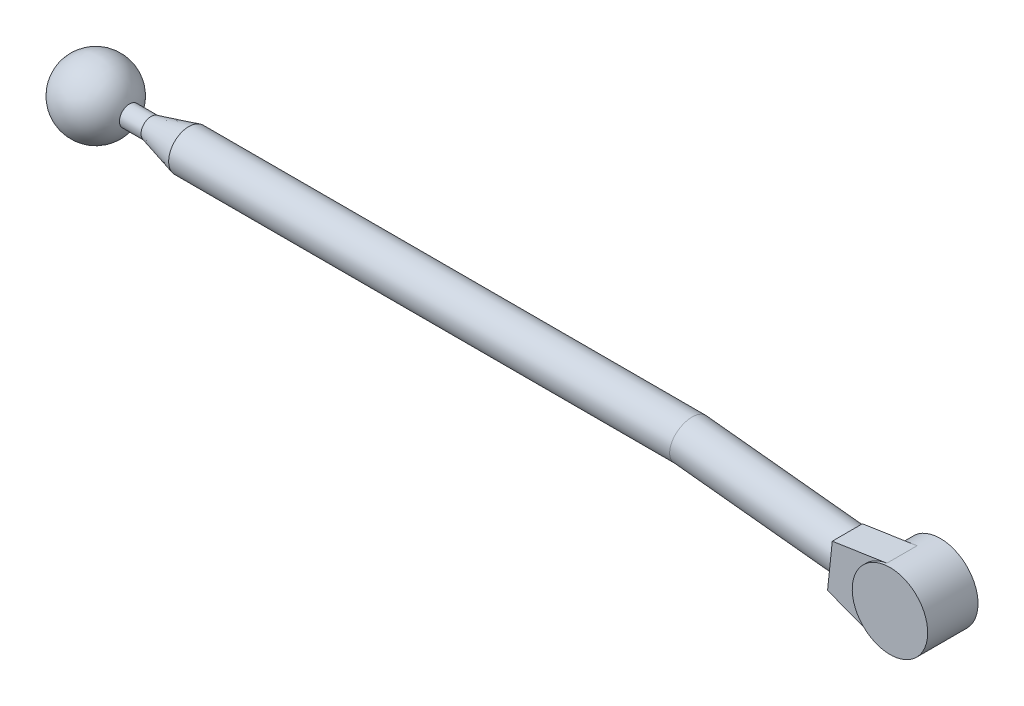
ISO-10303-21;
HEADER;
FILE_DESCRIPTION(('STEP AP214'),'2;1');
FILE_NAME('part.step','',(''),(''),'','','');
FILE_SCHEMA(('AUTOMOTIVE_DESIGN { 1 0 10303 214 1 1 1 1 }'));
ENDSEC;
DATA;
#1=APPLICATION_CONTEXT('core data for automotive mechanical design processes');
#2=APPLICATION_PROTOCOL_DEFINITION('international standard','automotive_design',2000,#1);
#3=PRODUCT_CONTEXT('',#1,'mechanical');
#4=PRODUCT('Part','Part','',(#3));
#5=PRODUCT_RELATED_PRODUCT_CATEGORY('part','',(#4));
#6=PRODUCT_DEFINITION_FORMATION('','',#4);
#7=PRODUCT_DEFINITION_CONTEXT('part definition',#1,'design');
#8=PRODUCT_DEFINITION('design','',#6,#7);
#9=PRODUCT_DEFINITION_SHAPE('','',#8);
#10=(LENGTH_UNIT() NAMED_UNIT(*) SI_UNIT(.MILLI.,.METRE.));
#11=(NAMED_UNIT(*) PLANE_ANGLE_UNIT() SI_UNIT($,.RADIAN.));
#12=(NAMED_UNIT(*) SI_UNIT($,.STERADIAN.) SOLID_ANGLE_UNIT());
#13=UNCERTAINTY_MEASURE_WITH_UNIT(LENGTH_MEASURE(1.E-05),#10,'distance_accuracy_value','');
#14=(GEOMETRIC_REPRESENTATION_CONTEXT(3) GLOBAL_UNCERTAINTY_ASSIGNED_CONTEXT((#13)) GLOBAL_UNIT_ASSIGNED_CONTEXT((#10,
#11,#12)) REPRESENTATION_CONTEXT('',''));
#15=CARTESIAN_POINT('',(0.,0.,0.));
#16=DIRECTION('',(0.,0.,1.));
#17=DIRECTION('',(1.,0.,0.));
#18=AXIS2_PLACEMENT_3D('',#15,#16,#17);
#19=CARTESIAN_POINT('',(237.639440017683,88.4268991587526,1407.2355645497));
#20=DIRECTION('',(0.,1.,0.));
#21=DIRECTION('',(0.,0.,-1.));
#22=AXIS2_PLACEMENT_3D('',#19,#20,#21);
#23=SPHERICAL_SURFACE('',#22,14.);
#24=CARTESIAN_POINT('',(237.639440017683,88.4268991587526,1407.2355645497));
#25=DIRECTION('',(-1.,0.,0.));
#26=DIRECTION('',(0.,1.,0.));
#27=AXIS2_PLACEMENT_3D('',#24,#25,#26);
#28=SPHERICAL_SURFACE('',#27,14.);
#29=CARTESIAN_POINT('',(251.055847882682,88.4268991587526,1407.2355645497));
#30=DIRECTION('',(-0.999999999999999,0.,0.));
#31=DIRECTION('',(0.,1.,0.));
#32=AXIS2_PLACEMENT_3D('',#29,#30,#31);
#33=CIRCLE('',#32,4.);
#34=CARTESIAN_POINT('',(251.055847882682,92.4268991587526,1407.2355645497));
#35=VERTEX_POINT('',#34);
#36=EDGE_CURVE('E179',#35,#35,#33,.F.);
#37=ORIENTED_EDGE('',*,*,#36,.F.);
#38=EDGE_LOOP('',(#37));
#39=FACE_BOUND('',#38,.T.);
#40=ADVANCED_FACE('F49',(#39),#28,.T.);
#41=CARTESIAN_POINT('',(259.639440017683,88.4268991587526,1407.2355645497));
#42=DIRECTION('',(-1.,0.,0.));
#43=DIRECTION('',(0.,1.,0.));
#44=AXIS2_PLACEMENT_3D('',#41,#42,#43);
#45=CYLINDRICAL_SURFACE('',#44,4.);
#46=CARTESIAN_POINT('',(259.639440017683,88.4268991587526,1407.2355645497));
#47=DIRECTION('',(1.,0.,0.));
#48=DIRECTION('',(0.,-1.,0.));
#49=AXIS2_PLACEMENT_3D('',#46,#47,#48);
#50=CIRCLE('',#49,4.);
#51=CARTESIAN_POINT('',(259.639440017683,84.4268991587526,1407.2355645497));
#52=VERTEX_POINT('',#51);
#53=EDGE_CURVE('E182',#52,#52,#50,.T.);
#54=ORIENTED_EDGE('',*,*,#53,.F.);
#55=EDGE_LOOP('',(#54));
#56=FACE_BOUND('',#55,.T.);
#57=ORIENTED_EDGE('',*,*,#36,.T.);
#58=EDGE_LOOP('',(#57));
#59=FACE_BOUND('',#58,.T.);
#60=ADVANCED_FACE('F168',(#56,#59),#45,.T.);
#61=CARTESIAN_POINT('',(259.639440017683,88.4268991587526,1407.2355645497));
#62=DIRECTION('',(1.,0.,0.));
#63=DIRECTION('',(0.,-1.,0.));
#64=AXIS2_PLACEMENT_3D('',#61,#62,#63);
#65=CONICAL_SURFACE('',#64,4.,0.261799387799149);
#66=CARTESIAN_POINT('',(274.639440017683,88.4268991587526,1407.2355645497));
#67=DIRECTION('',(1.,0.,0.));
#68=DIRECTION('',(0.,-1.,0.));
#69=AXIS2_PLACEMENT_3D('',#66,#67,#68);
#70=CIRCLE('',#69,8.01923788646685);
#71=CARTESIAN_POINT('',(274.639440017683,80.4076612722857,1407.2355645497));
#72=VERTEX_POINT('',#71);
#73=EDGE_CURVE('E150',#72,#72,#70,.T.);
#74=ORIENTED_EDGE('',*,*,#73,.F.);
#75=EDGE_LOOP('',(#74));
#76=FACE_BOUND('',#75,.T.);
#77=ORIENTED_EDGE('',*,*,#53,.T.);
#78=EDGE_LOOP('',(#77));
#79=FACE_BOUND('',#78,.T.);
#80=ADVANCED_FACE('F164',(#76,#79),#65,.T.);
#81=CARTESIAN_POINT('',(474.639440017683,88.4268991587526,1407.2355645497));
#82=DIRECTION('',(-1.,0.,0.));
#83=DIRECTION('',(0.,1.,0.));
#84=AXIS2_PLACEMENT_3D('',#81,#82,#83);
#85=CYLINDRICAL_SURFACE('',#84,8.01923788646685);
#86=CARTESIAN_POINT('',(473.796584152213,88.4268991587526,1407.2355645497));
#87=DIRECTION('',(0.994521895368274,-0.104528463267644,0.));
#88=DIRECTION('',(-0.104528463267644,-0.994521895368274,0.));
#89=AXIS2_PLACEMENT_3D('',#86,#87,#88);
#90=ELLIPSE('',#89,8.06341009063184,8.01923788646685);
#91=CARTESIAN_POINT('',(472.953728286742,80.4076612722857,1407.2355645497));
#92=VERTEX_POINT('',#91);
#93=EDGE_CURVE('E146',#92,#92,#90,.T.);
#94=ORIENTED_EDGE('',*,*,#93,.F.);
#95=EDGE_LOOP('',(#94));
#96=FACE_BOUND('',#95,.T.);
#97=ORIENTED_EDGE('',*,*,#73,.T.);
#98=EDGE_LOOP('',(#97));
#99=FACE_BOUND('',#98,.T.);
#100=ADVANCED_FACE('F159',(#96,#99),#85,.T.);
#101=CARTESIAN_POINT('',(538.440507351151,81.6325490463557,1407.2355645497));
#102=DIRECTION('',(0.994521895368274,-0.104528463267644,0.));
#103=DIRECTION('',(-0.104528463267644,-0.994521895368274,0.));
#104=AXIS2_PLACEMENT_3D('',#101,#102,#103);
#105=ELLIPSE('',#104,8.06341009063184,8.01923788646685);
#106=DIRECTION('',(-0.994521895368274,0.104528463267644,0.));
#107=VECTOR('',#106,1.);
#108=SURFACE_OF_LINEAR_EXTRUSION('',#105,#107);
#109=CARTESIAN_POINT('',(537.658852755104,74.1956023422475,1404.2355645497));
#110=VERTEX_POINT('',#109);
#111=CARTESIAN_POINT('',(539.222161947197,89.069495750464,1404.2355645497));
#112=VERTEX_POINT('',#111);
#113=EDGE_CURVE('E68',#110,#112,#105,.T.);
#114=ORIENTED_EDGE('',*,*,#113,.F.);
#115=EDGE_CURVE('E151',#112,#110,#105,.T.);
#116=ORIENTED_EDGE('',*,*,#115,.F.);
#117=EDGE_LOOP('',(#114,#116));
#118=FACE_BOUND('',#117,.T.);
#119=ORIENTED_EDGE('',*,*,#93,.T.);
#120=EDGE_LOOP('',(#119));
#121=FACE_BOUND('',#120,.T.);
#122=ADVANCED_FACE('F154',(#118,#121),#108,.F.);
#123=CARTESIAN_POINT('',(538.440507351151,81.6325490463557,1407.2355645497));
#124=DIRECTION('',(0.994521895368274,-0.104528463267644,0.));
#125=DIRECTION('',(-0.104528463267644,-0.994521895368274,0.));
#126=AXIS2_PLACEMENT_3D('',#123,#124,#125);
#127=PLANE('',#126);
#128=DIRECTION('',(0.104528463267639,0.994521895368275,0.));
#129=VECTOR('',#128,1.);
#130=CARTESIAN_POINT('',(539.38126352056,90.5832461046702,1404.2355645497));
#131=LINE('',#130,#129);
#132=EDGE_CURVE('E65',#110,#112,#131,.T.);
#133=ORIENTED_EDGE('',*,*,#132,.F.);
#134=ORIENTED_EDGE('',*,*,#113,.T.);
#135=EDGE_LOOP('',(#133,#134));
#136=FACE_BOUND('',#135,.T.);
#137=ADVANCED_FACE('F158',(#136),#127,.T.);
#138=CARTESIAN_POINT('',(539.38126352056,90.5832461046702,1404.2355645497));
#139=DIRECTION('',(0.994521895368275,-0.104528463267639,0.));
#140=DIRECTION('',(-0.104528463267639,-0.994521895368275,0.));
#141=AXIS2_PLACEMENT_3D('',#138,#139,#140);
#142=PLANE('',#141);
#143=CARTESIAN_POINT('',(539.38126352056,90.5832461046702,1404.2355645497));
#144=VERTEX_POINT('',#143);
#145=EDGE_CURVE('E131',#112,#144,#131,.T.);
#146=ORIENTED_EDGE('',*,*,#145,.F.);
#147=ORIENTED_EDGE('',*,*,#115,.T.);
#148=CARTESIAN_POINT('',(537.499751181742,72.6818519880413,1404.2355645497));
#149=VERTEX_POINT('',#148);
#150=EDGE_CURVE('E186',#149,#110,#131,.T.);
#151=ORIENTED_EDGE('',*,*,#150,.F.);
#152=DIRECTION('',(0.,0.,1.));
#153=VECTOR('',#152,1.);
#154=CARTESIAN_POINT('',(537.499751181742,72.6818519880413,1404.2355645497));
#155=LINE('',#154,#153);
#156=CARTESIAN_POINT('',(537.499751181742,72.6818519880413,1416.2355645497));
#157=VERTEX_POINT('',#156);
#158=EDGE_CURVE('E143',#149,#157,#155,.T.);
#159=ORIENTED_EDGE('',*,*,#158,.T.);
#160=DIRECTION('',(0.104528463267639,0.994521895368275,0.));
#161=VECTOR('',#160,1.);
#162=CARTESIAN_POINT('',(539.38126352056,90.5832461046702,1416.2355645497));
#163=LINE('',#162,#161);
#164=CARTESIAN_POINT('',(539.38126352056,90.5832461046702,1416.2355645497));
#165=VERTEX_POINT('',#164);
#166=EDGE_CURVE('E103',#157,#165,#163,.T.);
#167=ORIENTED_EDGE('',*,*,#166,.T.);
#168=DIRECTION('',(0.,0.,1.));
#169=VECTOR('',#168,1.);
#170=CARTESIAN_POINT('',(539.38126352056,90.5832461046702,1404.2355645497));
#171=LINE('',#170,#169);
#172=EDGE_CURVE('E139',#144,#165,#171,.T.);
#173=ORIENTED_EDGE('',*,*,#172,.F.);
#174=EDGE_LOOP('',(#146,#147,#151,#159,#167,#173));
#175=FACE_BOUND('',#174,.T.);
#176=ADVANCED_FACE('F228',(#175),#142,.F.);
#177=CARTESIAN_POINT('',(537.499751181742,72.6818519880413,1404.2355645497));
#178=DIRECTION('',(0.351367061986771,0.936237783765847,0.));
#179=DIRECTION('',(0.936237783765847,-0.351367061986771,0.));
#180=AXIS2_PLACEMENT_3D('',#177,#178,#179);
#181=PLANE('',#180);
#182=DIRECTION('',(-0.936237783765847,0.351367061986771,0.));
#183=VECTOR('',#182,1.);
#184=CARTESIAN_POINT('',(537.499751181742,72.6818519880413,1416.2355645497));
#185=LINE('',#184,#183);
#186=CARTESIAN_POINT('',(558.033048805556,64.975770708177,1416.2355645497));
#187=VERTEX_POINT('',#186);
#188=EDGE_CURVE('E96',#187,#157,#185,.T.);
#189=ORIENTED_EDGE('',*,*,#188,.T.);
#190=ORIENTED_EDGE('',*,*,#158,.F.);
#191=DIRECTION('',(-0.936237783765847,0.351367061986771,0.));
#192=VECTOR('',#191,1.);
#193=CARTESIAN_POINT('',(537.499751181742,72.6818519880413,1404.2355645497));
#194=LINE('',#193,#192);
#195=CARTESIAN_POINT('',(558.033048805556,64.975770708177,1404.2355645497));
#196=VERTEX_POINT('',#195);
#197=EDGE_CURVE('E115',#196,#149,#194,.T.);
#198=ORIENTED_EDGE('',*,*,#197,.F.);
#199=DIRECTION('',(0.,0.,1.));
#200=VECTOR('',#199,1.);
#201=CARTESIAN_POINT('',(558.033048805556,64.975770708177,1404.2355645497));
#202=LINE('',#201,#200);
#203=EDGE_CURVE('E112',#196,#187,#202,.T.);
#204=ORIENTED_EDGE('',*,*,#203,.T.);
#205=EDGE_LOOP('',(#189,#190,#198,#204));
#206=FACE_BOUND('',#205,.T.);
#207=ADVANCED_FACE('F113',(#206),#181,.F.);
#208=CARTESIAN_POINT('',(539.38126352056,90.5832461046702,1404.2355645497));
#209=DIRECTION('',(0.149034068029049,-0.988832061862232,0.));
#210=DIRECTION('',(-0.988832061862232,-0.149034068029049,0.));
#211=AXIS2_PLACEMENT_3D('',#208,#209,#210);
#212=PLANE('',#211);
#213=DIRECTION('',(0.988832061862232,0.149034068029049,0.));
#214=VECTOR('',#213,1.);
#215=CARTESIAN_POINT('',(539.38126352056,90.5832461046702,1416.2355645497));
#216=LINE('',#215,#214);
#217=CARTESIAN_POINT('',(561.068043714922,93.8518183925981,1416.2355645497));
#218=VERTEX_POINT('',#217);
#219=EDGE_CURVE('E126',#165,#218,#216,.T.);
#220=ORIENTED_EDGE('',*,*,#219,.T.);
#221=DIRECTION('',(0.,0.,1.));
#222=VECTOR('',#221,1.);
#223=CARTESIAN_POINT('',(561.068043714922,93.8518183925981,1404.2355645497));
#224=LINE('',#223,#222);
#225=CARTESIAN_POINT('',(561.068043714922,93.8518183925981,1404.2355645497));
#226=VERTEX_POINT('',#225);
#227=EDGE_CURVE('E119',#226,#218,#224,.T.);
#228=ORIENTED_EDGE('',*,*,#227,.F.);
#229=DIRECTION('',(0.988832061862232,0.149034068029049,0.));
#230=VECTOR('',#229,1.);
#231=CARTESIAN_POINT('',(539.38126352056,90.5832461046702,1404.2355645497));
#232=LINE('',#231,#230);
#233=EDGE_CURVE('E220',#144,#226,#232,.T.);
#234=ORIENTED_EDGE('',*,*,#233,.F.);
#235=ORIENTED_EDGE('',*,*,#172,.T.);
#236=EDGE_LOOP('',(#220,#228,#234,#235));
#237=FACE_BOUND('',#236,.T.);
#238=ADVANCED_FACE('F231',(#237),#212,.F.);
#239=CARTESIAN_POINT('',(563.303554735358,79.0193374646647,1404.2355645497));
#240=DIRECTION('',(0.,0.,-1.));
#241=DIRECTION('',(0.,1.,0.));
#242=AXIS2_PLACEMENT_3D('',#239,#240,#241);
#243=PLANE('',#242);
#244=ORIENTED_EDGE('',*,*,#197,.T.);
#245=ORIENTED_EDGE('',*,*,#150,.T.);
#246=ORIENTED_EDGE('',*,*,#132,.T.);
#247=ORIENTED_EDGE('',*,*,#145,.T.);
#248=ORIENTED_EDGE('',*,*,#233,.T.);
#249=CARTESIAN_POINT('',(563.303554735358,79.0193374646647,1404.2355645497));
#250=DIRECTION('',(0.,0.,1.));
#251=DIRECTION('',(0.,1.,0.));
#252=AXIS2_PLACEMENT_3D('',#249,#250,#251);
#253=CIRCLE('',#252,15.);
#254=EDGE_CURVE('E120',#226,#196,#253,.T.);
#255=ORIENTED_EDGE('',*,*,#254,.T.);
#256=EDGE_LOOP('',(#244,#245,#246,#247,#248,#255));
#257=FACE_BOUND('',#256,.T.);
#258=ADVANCED_FACE('F233',(#257),#243,.T.);
#259=CARTESIAN_POINT('',(563.303554735358,79.0193374646647,1416.2355645497));
#260=DIRECTION('',(0.,0.,-1.));
#261=DIRECTION('',(0.,1.,0.));
#262=AXIS2_PLACEMENT_3D('',#259,#260,#261);
#263=PLANE('',#262);
#264=ORIENTED_EDGE('',*,*,#188,.F.);
#265=CARTESIAN_POINT('',(563.303554735358,79.0193374646647,1416.2355645497));
#266=DIRECTION('',(0.,0.,1.));
#267=DIRECTION('',(0.,1.,0.));
#268=AXIS2_PLACEMENT_3D('',#265,#266,#267);
#269=CIRCLE('',#268,15.);
#270=EDGE_CURVE('E101',#218,#187,#269,.T.);
#271=ORIENTED_EDGE('',*,*,#270,.F.);
#272=ORIENTED_EDGE('',*,*,#219,.F.);
#273=ORIENTED_EDGE('',*,*,#166,.F.);
#274=EDGE_LOOP('',(#264,#271,#272,#273));
#275=FACE_BOUND('',#274,.T.);
#276=ADVANCED_FACE('F98',(#275),#263,.F.);
#277=CARTESIAN_POINT('',(563.303554735358,79.0193374646647,1397.2355645497));
#278=DIRECTION('',(0.,0.,1.));
#279=DIRECTION('',(0.,-1.,0.));
#280=AXIS2_PLACEMENT_3D('',#277,#278,#279);
#281=CYLINDRICAL_SURFACE('',#280,15.);
#282=ORIENTED_EDGE('',*,*,#254,.F.);
#283=ORIENTED_EDGE('',*,*,#227,.T.);
#284=ORIENTED_EDGE('',*,*,#270,.T.);
#285=ORIENTED_EDGE('',*,*,#203,.F.);
#286=EDGE_LOOP('',(#282,#283,#284,#285));
#287=FACE_BOUND('',#286,.T.);
#288=CARTESIAN_POINT('',(563.303554735358,79.0193374646647,1397.2355645497));
#289=DIRECTION('',(0.,0.,-1.));
#290=DIRECTION('',(0.,1.,0.));
#291=AXIS2_PLACEMENT_3D('',#288,#289,#290);
#292=CIRCLE('',#291,15.);
#293=CARTESIAN_POINT('',(563.303554735358,94.0193374646647,1397.2355645497));
#294=VERTEX_POINT('',#293);
#295=EDGE_CURVE('E108',#294,#294,#292,.T.);
#296=ORIENTED_EDGE('',*,*,#295,.F.);
#297=EDGE_LOOP('',(#296));
#298=FACE_BOUND('',#297,.T.);
#299=CARTESIAN_POINT('',(563.303554735358,79.0193374646647,1417.2355645497));
#300=DIRECTION('',(0.,0.,-1.));
#301=DIRECTION('',(0.,1.,0.));
#302=AXIS2_PLACEMENT_3D('',#299,#300,#301);
#303=CIRCLE('',#302,15.);
#304=CARTESIAN_POINT('',(563.303554735358,94.0193374646647,1417.2355645497));
#305=VERTEX_POINT('',#304);
#306=EDGE_CURVE('E212',#305,#305,#303,.T.);
#307=ORIENTED_EDGE('',*,*,#306,.T.);
#308=EDGE_LOOP('',(#307));
#309=FACE_BOUND('',#308,.T.);
#310=ADVANCED_FACE('F122',(#287,#298,#309),#281,.T.);
#311=CARTESIAN_POINT('',(563.303554735358,79.0193374646647,1397.2355645497));
#312=DIRECTION('',(0.,0.,-1.));
#313=DIRECTION('',(0.,1.,0.));
#314=AXIS2_PLACEMENT_3D('',#311,#312,#313);
#315=PLANE('',#314);
#316=CARTESIAN_POINT('',(563.303554735358,79.0193374646647,1397.2355645497));
#317=DIRECTION('',(0.,0.,-1.));
#318=DIRECTION('',(0.,1.,0.));
#319=AXIS2_PLACEMENT_3D('',#316,#317,#318);
#320=CIRCLE('',#319,13.);
#321=CARTESIAN_POINT('',(563.303554735358,92.0193374646647,1397.2355645497));
#322=VERTEX_POINT('',#321);
#323=EDGE_CURVE('E11',#322,#322,#320,.F.);
#324=ORIENTED_EDGE('',*,*,#323,.T.);
#325=EDGE_LOOP('',(#324));
#326=FACE_BOUND('',#325,.T.);
#327=ORIENTED_EDGE('',*,*,#295,.T.);
#328=EDGE_LOOP('',(#327));
#329=FACE_BOUND('',#328,.T.);
#330=ADVANCED_FACE('F206',(#326,#329),#315,.T.);
#331=CARTESIAN_POINT('',(563.303554735358,79.0193374646647,1417.2355645497));
#332=DIRECTION('',(0.,0.,-1.));
#333=DIRECTION('',(0.,1.,0.));
#334=AXIS2_PLACEMENT_3D('',#331,#332,#333);
#335=PLANE('',#334);
#336=ORIENTED_EDGE('',*,*,#306,.F.);
#337=EDGE_LOOP('',(#336));
#338=FACE_BOUND('',#337,.T.);
#339=ADVANCED_FACE('F202',(#338),#335,.F.);
#340=CARTESIAN_POINT('',(563.303554735358,79.0193374646647,1405.2355645497));
#341=DIRECTION('',(1.,0.,0.));
#342=DIRECTION('',(0.,-1.,0.));
#343=AXIS2_PLACEMENT_3D('',#340,#341,#342);
#344=SPHERICAL_SURFACE('',#343,10.);
#345=CARTESIAN_POINT('',(563.303554735358,79.0193374646647,1405.2355645497));
#346=DIRECTION('',(0.,0.,1.));
#347=DIRECTION('',(0.,-1.,0.));
#348=AXIS2_PLACEMENT_3D('',#345,#346,#347);
#349=SPHERICAL_SURFACE('',#348,10.);
#350=CARTESIAN_POINT('',(563.303554735358,79.0193374646647,1399.32865793649));
#351=DIRECTION('',(0.,0.,1.));
#352=DIRECTION('',(0.,-1.,0.));
#353=AXIS2_PLACEMENT_3D('',#350,#351,#352);
#354=CIRCLE('',#353,8.06898099284036);
#355=CARTESIAN_POINT('',(563.303554735358,70.9503564718244,1399.32865793649));
#356=VERTEX_POINT('',#355);
#357=EDGE_CURVE('E59',#356,#356,#354,.F.);
#358=ORIENTED_EDGE('',*,*,#357,.T.);
#359=EDGE_LOOP('',(#358));
#360=FACE_BOUND('',#359,.T.);
#361=ADVANCED_FACE('F194',(#360),#349,.F.);
#362=CARTESIAN_POINT('',(563.303554735358,79.0193374646647,1399.32865793649));
#363=DIRECTION('',(0.,0.,-1.));
#364=DIRECTION('',(0.,1.,0.));
#365=AXIS2_PLACEMENT_3D('',#362,#363,#364);
#366=CONICAL_SURFACE('',#365,8.06898099284036,1.16937059883619);
#367=ORIENTED_EDGE('',*,*,#323,.F.);
#368=EDGE_LOOP('',(#367));
#369=FACE_BOUND('',#368,.T.);
#370=ORIENTED_EDGE('',*,*,#357,.F.);
#371=EDGE_LOOP('',(#370));
#372=FACE_BOUND('',#371,.T.);
#373=ADVANCED_FACE('F52',(#369,#372),#366,.F.);
#374=CLOSED_SHELL('',(#40,#60,#80,#100,#122,#137,#176,#207,#238,#258,#276,#310,#330,#339,#361,#373));
#375=MANIFOLD_SOLID_BREP('B2',#374);
#376=ADVANCED_BREP_SHAPE_REPRESENTATION('',(#18,#375),#14);
#377=SHAPE_DEFINITION_REPRESENTATION(#9,#376);
ENDSEC;
END-ISO-10303-21;
